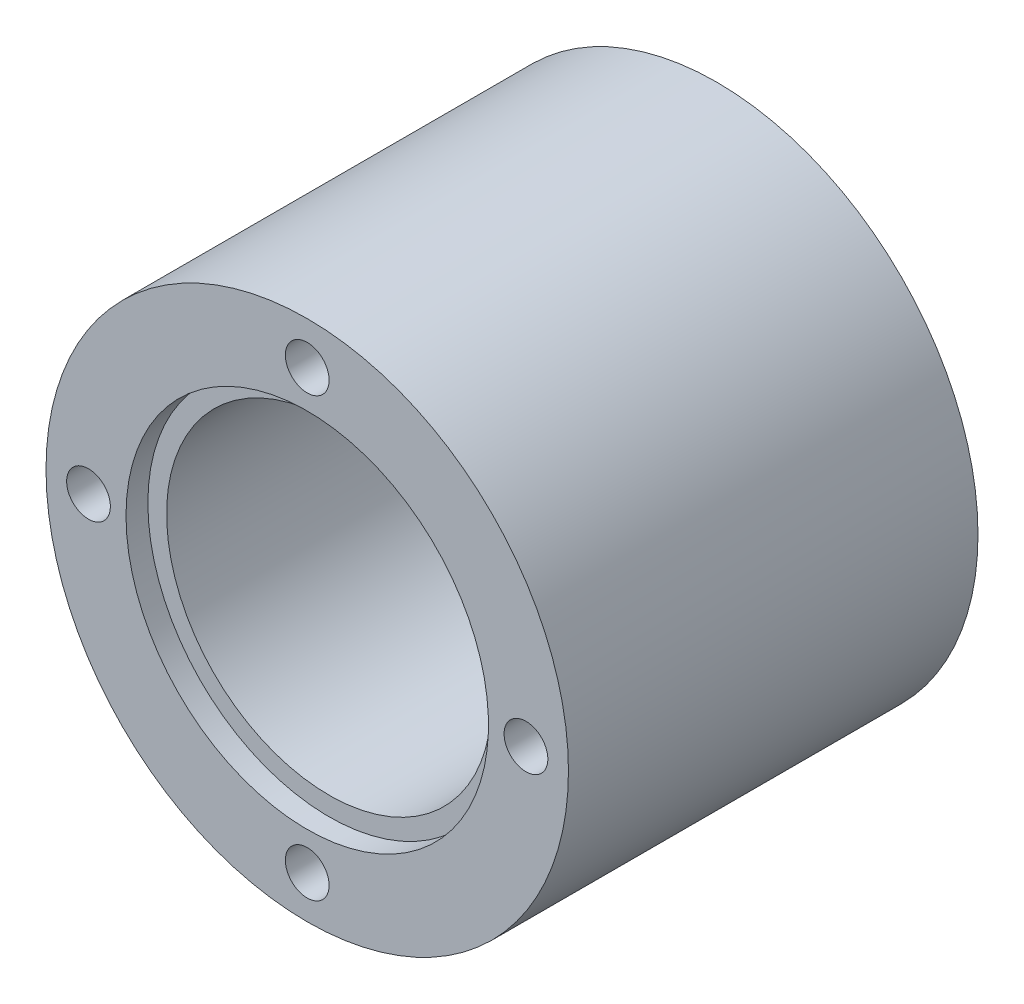
ISO-10303-21;
HEADER;
FILE_DESCRIPTION(('STEP AP214'),'2;1');
FILE_NAME('part.step','',(''),(''),'','','');
FILE_SCHEMA(('AUTOMOTIVE_DESIGN { 1 0 10303 214 1 1 1 1 }'));
ENDSEC;
DATA;
#1=APPLICATION_CONTEXT('core data for automotive mechanical design processes');
#2=APPLICATION_PROTOCOL_DEFINITION('international standard','automotive_design',2000,#1);
#3=PRODUCT_CONTEXT('',#1,'mechanical');
#4=PRODUCT('Part','Part','',(#3));
#5=PRODUCT_RELATED_PRODUCT_CATEGORY('part','',(#4));
#6=PRODUCT_DEFINITION_FORMATION('','',#4);
#7=PRODUCT_DEFINITION_CONTEXT('part definition',#1,'design');
#8=PRODUCT_DEFINITION('design','',#6,#7);
#9=PRODUCT_DEFINITION_SHAPE('','',#8);
#10=(LENGTH_UNIT() NAMED_UNIT(*) SI_UNIT(.MILLI.,.METRE.));
#11=(NAMED_UNIT(*) PLANE_ANGLE_UNIT() SI_UNIT($,.RADIAN.));
#12=(NAMED_UNIT(*) SI_UNIT($,.STERADIAN.) SOLID_ANGLE_UNIT());
#13=UNCERTAINTY_MEASURE_WITH_UNIT(LENGTH_MEASURE(1.E-05),#10,'distance_accuracy_value','');
#14=(GEOMETRIC_REPRESENTATION_CONTEXT(3) GLOBAL_UNCERTAINTY_ASSIGNED_CONTEXT((#13)) GLOBAL_UNIT_ASSIGNED_CONTEXT((#10,
#11,#12)) REPRESENTATION_CONTEXT('',''));
#15=CARTESIAN_POINT('',(0.,0.,0.));
#16=DIRECTION('',(0.,0.,1.));
#17=DIRECTION('',(1.,0.,0.));
#18=AXIS2_PLACEMENT_3D('',#15,#16,#17);
#19=CARTESIAN_POINT('',(0.,0.,0.));
#20=DIRECTION('',(0.,0.,1.));
#21=DIRECTION('',(1.,0.,0.));
#22=AXIS2_PLACEMENT_3D('',#19,#20,#21);
#23=CYLINDRICAL_SURFACE('',#22,13.);
#24=CARTESIAN_POINT('',(0.,0.,-14.633));
#25=DIRECTION('',(0.,0.,1.));
#26=DIRECTION('',(1.,0.,0.));
#27=AXIS2_PLACEMENT_3D('',#24,#25,#26);
#28=CIRCLE('',#27,13.);
#29=CARTESIAN_POINT('',(13.,0.,-14.633));
#30=VERTEX_POINT('',#29);
#31=EDGE_CURVE('E19',#30,#30,#28,.F.);
#32=ORIENTED_EDGE('',*,*,#31,.T.);
#33=EDGE_LOOP('',(#32));
#34=FACE_BOUND('',#33,.T.);
#35=CARTESIAN_POINT('',(0.,0.,14.633));
#36=DIRECTION('',(0.,0.,1.));
#37=DIRECTION('',(1.,0.,0.));
#38=AXIS2_PLACEMENT_3D('',#35,#36,#37);
#39=CIRCLE('',#38,13.);
#40=CARTESIAN_POINT('',(13.,0.,14.633));
#41=VERTEX_POINT('',#40);
#42=EDGE_CURVE('E65',#41,#41,#39,.T.);
#43=ORIENTED_EDGE('',*,*,#42,.T.);
#44=EDGE_LOOP('',(#43));
#45=FACE_BOUND('',#44,.T.);
#46=ADVANCED_FACE('F15',(#34,#45),#23,.F.);
#47=CARTESIAN_POINT('',(14.5,14.79,-14.633));
#48=DIRECTION('',(0.,0.,1.));
#49=DIRECTION('',(-1.,0.,0.));
#50=AXIS2_PLACEMENT_3D('',#47,#48,#49);
#51=PLANE('',#50);
#52=ORIENTED_EDGE('',*,*,#31,.F.);
#53=EDGE_LOOP('',(#52));
#54=FACE_BOUND('',#53,.T.);
#55=CARTESIAN_POINT('',(0.,0.,-14.633));
#56=DIRECTION('',(0.,0.,1.));
#57=DIRECTION('',(0.,-1.,0.));
#58=AXIS2_PLACEMENT_3D('',#55,#56,#57);
#59=CIRCLE('',#58,14.5);
#60=CARTESIAN_POINT('',(0.,-14.5,-14.633));
#61=VERTEX_POINT('',#60);
#62=EDGE_CURVE('E63',#61,#61,#59,.F.);
#63=ORIENTED_EDGE('',*,*,#62,.T.);
#64=EDGE_LOOP('',(#63));
#65=FACE_BOUND('',#64,.T.);
#66=ADVANCED_FACE('F73',(#54,#65),#51,.F.);
#67=CARTESIAN_POINT('',(0.,0.,14.633));
#68=DIRECTION('',(0.,0.,-1.));
#69=DIRECTION('',(-1.,0.,0.));
#70=AXIS2_PLACEMENT_3D('',#67,#68,#69);
#71=PLANE('',#70);
#72=ORIENTED_EDGE('',*,*,#42,.F.);
#73=EDGE_LOOP('',(#72));
#74=FACE_BOUND('',#73,.T.);
#75=CARTESIAN_POINT('',(0.,0.,14.633));
#76=DIRECTION('',(0.,0.,-1.));
#77=DIRECTION('',(-1.,0.,0.));
#78=AXIS2_PLACEMENT_3D('',#75,#76,#77);
#79=CIRCLE('',#78,14.5);
#80=CARTESIAN_POINT('',(-14.5,0.,14.633));
#81=VERTEX_POINT('',#80);
#82=EDGE_CURVE('E60',#81,#81,#79,.F.);
#83=ORIENTED_EDGE('',*,*,#82,.T.);
#84=EDGE_LOOP('',(#83));
#85=FACE_BOUND('',#84,.T.);
#86=ADVANCED_FACE('F76',(#74,#85),#71,.F.);
#87=CARTESIAN_POINT('',(0.,0.,-16.383));
#88=DIRECTION('',(0.,0.,1.));
#89=DIRECTION('',(0.,-1.,0.));
#90=AXIS2_PLACEMENT_3D('',#87,#88,#89);
#91=CYLINDRICAL_SURFACE('',#90,14.5);
#92=ORIENTED_EDGE('',*,*,#62,.F.);
#93=EDGE_LOOP('',(#92));
#94=FACE_BOUND('',#93,.T.);
#95=CARTESIAN_POINT('',(0.,0.,-16.383));
#96=DIRECTION('',(0.,0.,1.));
#97=DIRECTION('',(0.,-1.,0.));
#98=AXIS2_PLACEMENT_3D('',#95,#96,#97);
#99=CIRCLE('',#98,14.5);
#100=CARTESIAN_POINT('',(0.,-14.5,-16.383));
#101=VERTEX_POINT('',#100);
#102=EDGE_CURVE('E57',#101,#101,#99,.T.);
#103=ORIENTED_EDGE('',*,*,#102,.F.);
#104=EDGE_LOOP('',(#103));
#105=FACE_BOUND('',#104,.T.);
#106=ADVANCED_FACE('F80',(#94,#105),#91,.F.);
#107=CARTESIAN_POINT('',(0.,0.,16.383));
#108=DIRECTION('',(0.,0.,-1.));
#109=DIRECTION('',(-1.,0.,0.));
#110=AXIS2_PLACEMENT_3D('',#107,#108,#109);
#111=CYLINDRICAL_SURFACE('',#110,14.5);
#112=CARTESIAN_POINT('',(0.,0.,16.383));
#113=DIRECTION('',(0.,0.,-1.));
#114=DIRECTION('',(-1.,0.,0.));
#115=AXIS2_PLACEMENT_3D('',#112,#113,#114);
#116=CIRCLE('',#115,14.5);
#117=CARTESIAN_POINT('',(-14.5,0.,16.383));
#118=VERTEX_POINT('',#117);
#119=EDGE_CURVE('E42',#118,#118,#116,.F.);
#120=ORIENTED_EDGE('',*,*,#119,.T.);
#121=EDGE_LOOP('',(#120));
#122=FACE_BOUND('',#121,.T.);
#123=ORIENTED_EDGE('',*,*,#82,.F.);
#124=EDGE_LOOP('',(#123));
#125=FACE_BOUND('',#124,.T.);
#126=ADVANCED_FACE('F83',(#122,#125),#111,.F.);
#127=CARTESIAN_POINT('',(0.,-17.5,16.383));
#128=DIRECTION('',(0.,0.,-1.));
#129=DIRECTION('',(0.,1.,0.));
#130=AXIS2_PLACEMENT_3D('',#127,#128,#129);
#131=CYLINDRICAL_SURFACE('',#130,1.75000000000001);
#132=CARTESIAN_POINT('',(0.,-17.4999999999999,-16.383));
#133=DIRECTION('',(0.,0.,-1.));
#134=DIRECTION('',(0.,1.,0.));
#135=AXIS2_PLACEMENT_3D('',#132,#133,#134);
#136=CIRCLE('',#135,1.75000000000001);
#137=CARTESIAN_POINT('',(0.,-15.7499999999999,-16.383));
#138=VERTEX_POINT('',#137);
#139=EDGE_CURVE('E54',#138,#138,#136,.F.);
#140=ORIENTED_EDGE('',*,*,#139,.F.);
#141=EDGE_LOOP('',(#140));
#142=FACE_BOUND('',#141,.T.);
#143=CARTESIAN_POINT('',(0.,-17.5,16.383));
#144=DIRECTION('',(0.,0.,-1.));
#145=DIRECTION('',(0.,1.,0.));
#146=AXIS2_PLACEMENT_3D('',#143,#144,#145);
#147=CIRCLE('',#146,1.75000000000001);
#148=CARTESIAN_POINT('',(0.,-15.75,16.383));
#149=VERTEX_POINT('',#148);
#150=EDGE_CURVE('E39',#149,#149,#147,.F.);
#151=ORIENTED_EDGE('',*,*,#150,.T.);
#152=EDGE_LOOP('',(#151));
#153=FACE_BOUND('',#152,.T.);
#154=ADVANCED_FACE('F107',(#142,#153),#131,.F.);
#155=CARTESIAN_POINT('',(-17.5,0.,16.383));
#156=DIRECTION('',(0.,0.,-1.));
#157=DIRECTION('',(0.,1.,0.));
#158=AXIS2_PLACEMENT_3D('',#155,#156,#157);
#159=CYLINDRICAL_SURFACE('',#158,1.75);
#160=CARTESIAN_POINT('',(-17.4999999999999,0.,-16.383));
#161=DIRECTION('',(0.,0.,-1.));
#162=DIRECTION('',(0.,1.,0.));
#163=AXIS2_PLACEMENT_3D('',#160,#161,#162);
#164=CIRCLE('',#163,1.75);
#165=CARTESIAN_POINT('',(-17.4999999999999,1.74999999999994,-16.383));
#166=VERTEX_POINT('',#165);
#167=EDGE_CURVE('E51',#166,#166,#164,.F.);
#168=ORIENTED_EDGE('',*,*,#167,.F.);
#169=EDGE_LOOP('',(#168));
#170=FACE_BOUND('',#169,.T.);
#171=CARTESIAN_POINT('',(-17.5,0.,16.383));
#172=DIRECTION('',(0.,0.,-1.));
#173=DIRECTION('',(0.,1.,0.));
#174=AXIS2_PLACEMENT_3D('',#171,#172,#173);
#175=CIRCLE('',#174,1.75);
#176=CARTESIAN_POINT('',(-17.5,1.75,16.383));
#177=VERTEX_POINT('',#176);
#178=EDGE_CURVE('E36',#177,#177,#175,.F.);
#179=ORIENTED_EDGE('',*,*,#178,.T.);
#180=EDGE_LOOP('',(#179));
#181=FACE_BOUND('',#180,.T.);
#182=ADVANCED_FACE('F116',(#170,#181),#159,.F.);
#183=CARTESIAN_POINT('',(17.5,0.,16.383));
#184=DIRECTION('',(0.,0.,-1.));
#185=DIRECTION('',(0.,1.,0.));
#186=AXIS2_PLACEMENT_3D('',#183,#184,#185);
#187=CYLINDRICAL_SURFACE('',#186,1.75);
#188=CARTESIAN_POINT('',(17.4999999999999,0.,-16.383));
#189=DIRECTION('',(0.,0.,-1.));
#190=DIRECTION('',(0.,1.,0.));
#191=AXIS2_PLACEMENT_3D('',#188,#189,#190);
#192=CIRCLE('',#191,1.75);
#193=CARTESIAN_POINT('',(17.4999999999999,1.75000000000006,-16.383));
#194=VERTEX_POINT('',#193);
#195=EDGE_CURVE('E48',#194,#194,#192,.F.);
#196=ORIENTED_EDGE('',*,*,#195,.F.);
#197=EDGE_LOOP('',(#196));
#198=FACE_BOUND('',#197,.T.);
#199=CARTESIAN_POINT('',(17.5,0.,16.383));
#200=DIRECTION('',(0.,0.,-1.));
#201=DIRECTION('',(0.,1.,0.));
#202=AXIS2_PLACEMENT_3D('',#199,#200,#201);
#203=CIRCLE('',#202,1.75);
#204=CARTESIAN_POINT('',(17.5,1.75,16.383));
#205=VERTEX_POINT('',#204);
#206=EDGE_CURVE('E33',#205,#205,#203,.F.);
#207=ORIENTED_EDGE('',*,*,#206,.T.);
#208=EDGE_LOOP('',(#207));
#209=FACE_BOUND('',#208,.T.);
#210=ADVANCED_FACE('F119',(#198,#209),#187,.F.);
#211=CARTESIAN_POINT('',(0.,17.5,16.383));
#212=DIRECTION('',(0.,0.,-1.));
#213=DIRECTION('',(-1.,0.,0.));
#214=AXIS2_PLACEMENT_3D('',#211,#212,#213);
#215=CYLINDRICAL_SURFACE('',#214,1.75000000000001);
#216=CARTESIAN_POINT('',(0.,17.4999999999999,-16.383));
#217=DIRECTION('',(0.,0.,-1.));
#218=DIRECTION('',(-1.,0.,0.));
#219=AXIS2_PLACEMENT_3D('',#216,#217,#218);
#220=CIRCLE('',#219,1.75000000000001);
#221=CARTESIAN_POINT('',(-1.75000000000008,17.4999999999999,-16.383));
#222=VERTEX_POINT('',#221);
#223=EDGE_CURVE('E45',#222,#222,#220,.F.);
#224=ORIENTED_EDGE('',*,*,#223,.F.);
#225=EDGE_LOOP('',(#224));
#226=FACE_BOUND('',#225,.T.);
#227=CARTESIAN_POINT('',(0.,17.5,16.383));
#228=DIRECTION('',(0.,0.,-1.));
#229=DIRECTION('',(-1.,0.,0.));
#230=AXIS2_PLACEMENT_3D('',#227,#228,#229);
#231=CIRCLE('',#230,1.75000000000001);
#232=CARTESIAN_POINT('',(-1.75000000000001,17.5,16.383));
#233=VERTEX_POINT('',#232);
#234=EDGE_CURVE('E28',#233,#233,#231,.F.);
#235=ORIENTED_EDGE('',*,*,#234,.T.);
#236=EDGE_LOOP('',(#235));
#237=FACE_BOUND('',#236,.T.);
#238=ADVANCED_FACE('F17',(#226,#237),#215,.F.);
#239=CARTESIAN_POINT('',(0.,0.,-16.383));
#240=DIRECTION('',(0.,0.,-1.));
#241=DIRECTION('',(-1.,0.,0.));
#242=AXIS2_PLACEMENT_3D('',#239,#240,#241);
#243=PLANE('',#242);
#244=ORIENTED_EDGE('',*,*,#223,.T.);
#245=EDGE_LOOP('',(#244));
#246=FACE_BOUND('',#245,.T.);
#247=ORIENTED_EDGE('',*,*,#195,.T.);
#248=EDGE_LOOP('',(#247));
#249=FACE_BOUND('',#248,.T.);
#250=ORIENTED_EDGE('',*,*,#167,.T.);
#251=EDGE_LOOP('',(#250));
#252=FACE_BOUND('',#251,.T.);
#253=ORIENTED_EDGE('',*,*,#139,.T.);
#254=EDGE_LOOP('',(#253));
#255=FACE_BOUND('',#254,.T.);
#256=ORIENTED_EDGE('',*,*,#102,.T.);
#257=EDGE_LOOP('',(#256));
#258=FACE_BOUND('',#257,.T.);
#259=CARTESIAN_POINT('',(0.,0.,-16.383));
#260=DIRECTION('',(0.,0.,1.));
#261=DIRECTION('',(1.,0.,0.));
#262=AXIS2_PLACEMENT_3D('',#259,#260,#261);
#263=CIRCLE('',#262,20.9);
#264=CARTESIAN_POINT('',(20.9,0.,-16.383));
#265=VERTEX_POINT('',#264);
#266=EDGE_CURVE('E23',#265,#265,#263,.T.);
#267=ORIENTED_EDGE('',*,*,#266,.F.);
#268=EDGE_LOOP('',(#267));
#269=FACE_BOUND('',#268,.T.);
#270=ADVANCED_FACE('F87',(#246,#249,#252,#255,#258,#269),#243,.T.);
#271=CARTESIAN_POINT('',(0.,0.,16.383));
#272=DIRECTION('',(0.,0.,-1.));
#273=DIRECTION('',(-1.,0.,0.));
#274=AXIS2_PLACEMENT_3D('',#271,#272,#273);
#275=PLANE('',#274);
#276=ORIENTED_EDGE('',*,*,#234,.F.);
#277=EDGE_LOOP('',(#276));
#278=FACE_BOUND('',#277,.T.);
#279=ORIENTED_EDGE('',*,*,#206,.F.);
#280=EDGE_LOOP('',(#279));
#281=FACE_BOUND('',#280,.T.);
#282=ORIENTED_EDGE('',*,*,#178,.F.);
#283=EDGE_LOOP('',(#282));
#284=FACE_BOUND('',#283,.T.);
#285=ORIENTED_EDGE('',*,*,#150,.F.);
#286=EDGE_LOOP('',(#285));
#287=FACE_BOUND('',#286,.T.);
#288=ORIENTED_EDGE('',*,*,#119,.F.);
#289=EDGE_LOOP('',(#288));
#290=FACE_BOUND('',#289,.T.);
#291=CARTESIAN_POINT('',(0.,0.,16.383));
#292=DIRECTION('',(0.,0.,1.));
#293=DIRECTION('',(1.,0.,0.));
#294=AXIS2_PLACEMENT_3D('',#291,#292,#293);
#295=CIRCLE('',#294,20.9);
#296=CARTESIAN_POINT('',(20.9,0.,16.383));
#297=VERTEX_POINT('',#296);
#298=EDGE_CURVE('E10',#297,#297,#295,.F.);
#299=ORIENTED_EDGE('',*,*,#298,.F.);
#300=EDGE_LOOP('',(#299));
#301=FACE_BOUND('',#300,.T.);
#302=ADVANCED_FACE('F90',(#278,#281,#284,#287,#290,#301),#275,.F.);
#303=CARTESIAN_POINT('',(0.,0.,0.));
#304=DIRECTION('',(0.,0.,1.));
#305=DIRECTION('',(1.,0.,0.));
#306=AXIS2_PLACEMENT_3D('',#303,#304,#305);
#307=CYLINDRICAL_SURFACE('',#306,20.9);
#308=ORIENTED_EDGE('',*,*,#266,.T.);
#309=EDGE_LOOP('',(#308));
#310=FACE_BOUND('',#309,.T.);
#311=ORIENTED_EDGE('',*,*,#298,.T.);
#312=EDGE_LOOP('',(#311));
#313=FACE_BOUND('',#312,.T.);
#314=ADVANCED_FACE('F95',(#310,#313),#307,.T.);
#315=CLOSED_SHELL('',(#46,#66,#86,#106,#126,#154,#182,#210,#238,#270,#302,#314));
#316=MANIFOLD_SOLID_BREP('B1',#315);
#317=ADVANCED_BREP_SHAPE_REPRESENTATION('',(#18,#316),#14);
#318=SHAPE_DEFINITION_REPRESENTATION(#9,#317);
ENDSEC;
END-ISO-10303-21;
